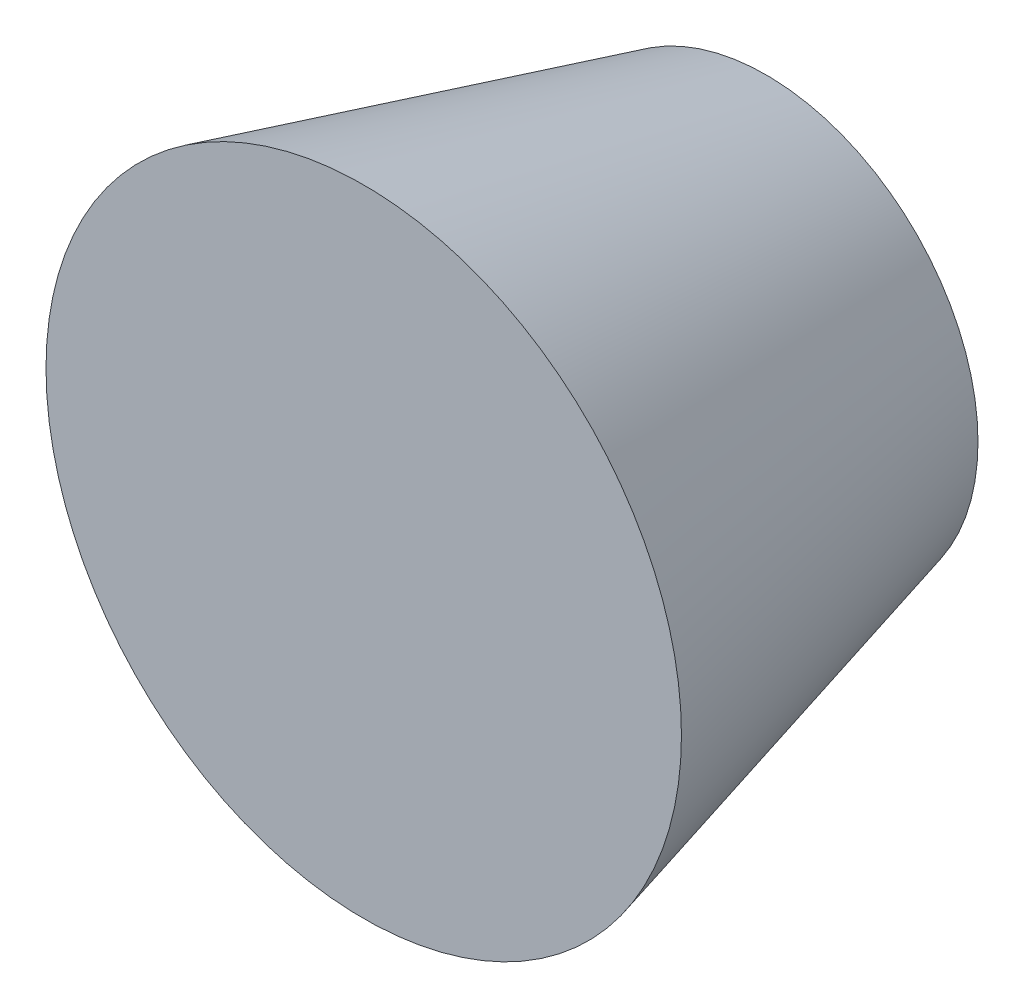
ISO-10303-21;
HEADER;
FILE_DESCRIPTION(('STEP AP214'),'2;1');
FILE_NAME('part.step','',(''),(''),'','','');
FILE_SCHEMA(('AUTOMOTIVE_DESIGN { 1 0 10303 214 1 1 1 1 }'));
ENDSEC;
DATA;
#1=APPLICATION_CONTEXT('core data for automotive mechanical design processes');
#2=APPLICATION_PROTOCOL_DEFINITION('international standard','automotive_design',2000,#1);
#3=PRODUCT_CONTEXT('',#1,'mechanical');
#4=PRODUCT('Part','Part','',(#3));
#5=PRODUCT_RELATED_PRODUCT_CATEGORY('part','',(#4));
#6=PRODUCT_DEFINITION_FORMATION('','',#4);
#7=PRODUCT_DEFINITION_CONTEXT('part definition',#1,'design');
#8=PRODUCT_DEFINITION('design','',#6,#7);
#9=PRODUCT_DEFINITION_SHAPE('','',#8);
#10=(LENGTH_UNIT() NAMED_UNIT(*) SI_UNIT(.MILLI.,.METRE.));
#11=(NAMED_UNIT(*) PLANE_ANGLE_UNIT() SI_UNIT($,.RADIAN.));
#12=(NAMED_UNIT(*) SI_UNIT($,.STERADIAN.) SOLID_ANGLE_UNIT());
#13=UNCERTAINTY_MEASURE_WITH_UNIT(LENGTH_MEASURE(1.E-05),#10,'distance_accuracy_value','');
#14=(GEOMETRIC_REPRESENTATION_CONTEXT(3) GLOBAL_UNCERTAINTY_ASSIGNED_CONTEXT((#13)) GLOBAL_UNIT_ASSIGNED_CONTEXT((#10,
#11,#12)) REPRESENTATION_CONTEXT('',''));
#15=CARTESIAN_POINT('',(0.,0.,0.));
#16=DIRECTION('',(0.,0.,1.));
#17=DIRECTION('',(1.,0.,0.));
#18=AXIS2_PLACEMENT_3D('',#15,#16,#17);
#19=CARTESIAN_POINT('',(0.,0.,19.));
#20=DIRECTION('',(0.,0.,1.));
#21=DIRECTION('',(1.,0.,0.));
#22=AXIS2_PLACEMENT_3D('',#19,#20,#21);
#23=PLANE('',#22);
#24=CARTESIAN_POINT('',(0.,0.,19.));
#25=DIRECTION('',(0.,0.,1.));
#26=DIRECTION('',(1.,0.,0.));
#27=AXIS2_PLACEMENT_3D('',#24,#25,#26);
#28=CIRCLE('',#27,15.);
#29=CARTESIAN_POINT('',(15.,0.,19.));
#30=VERTEX_POINT('',#29);
#31=EDGE_CURVE('E11',#30,#30,#28,.T.);
#32=ORIENTED_EDGE('',*,*,#31,.T.);
#33=EDGE_LOOP('',(#32));
#34=FACE_BOUND('',#33,.T.);
#35=ADVANCED_FACE('F36',(#34),#23,.T.);
#36=CARTESIAN_POINT('',(0.,0.,0.));
#37=DIRECTION('',(0.,0.,1.));
#38=DIRECTION('',(1.,0.,0.));
#39=AXIS2_PLACEMENT_3D('',#36,#37,#38);
#40=PLANE('',#39);
#41=CARTESIAN_POINT('',(0.,0.,0.));
#42=DIRECTION('',(0.,0.,1.));
#43=DIRECTION('',(1.,0.,0.));
#44=AXIS2_PLACEMENT_3D('',#41,#42,#43);
#45=CIRCLE('',#44,10.);
#46=CARTESIAN_POINT('',(10.,0.,0.));
#47=VERTEX_POINT('',#46);
#48=EDGE_CURVE('E44',#47,#47,#45,.T.);
#49=ORIENTED_EDGE('',*,*,#48,.F.);
#50=EDGE_LOOP('',(#49));
#51=FACE_BOUND('',#50,.T.);
#52=ADVANCED_FACE('F67',(#51),#40,.F.);
#53=CARTESIAN_POINT('',(0.,0.,0.));
#54=DIRECTION('',(0.,0.,1.));
#55=DIRECTION('',(1.,0.,0.));
#56=AXIS2_PLACEMENT_3D('',#53,#54,#55);
#57=CONICAL_SURFACE('',#56,10.,0.257323714971089);
#58=ORIENTED_EDGE('',*,*,#48,.T.);
#59=EDGE_LOOP('',(#58));
#60=FACE_BOUND('',#59,.T.);
#61=ORIENTED_EDGE('',*,*,#31,.F.);
#62=EDGE_LOOP('',(#61));
#63=FACE_BOUND('',#62,.T.);
#64=ADVANCED_FACE('F75',(#60,#63),#57,.T.);
#65=CLOSED_SHELL('',(#35,#52,#64));
#66=MANIFOLD_SOLID_BREP('B2',#65);
#67=ADVANCED_BREP_SHAPE_REPRESENTATION('',(#18,#66),#14);
#68=SHAPE_DEFINITION_REPRESENTATION(#9,#67);
ENDSEC;
END-ISO-10303-21;
